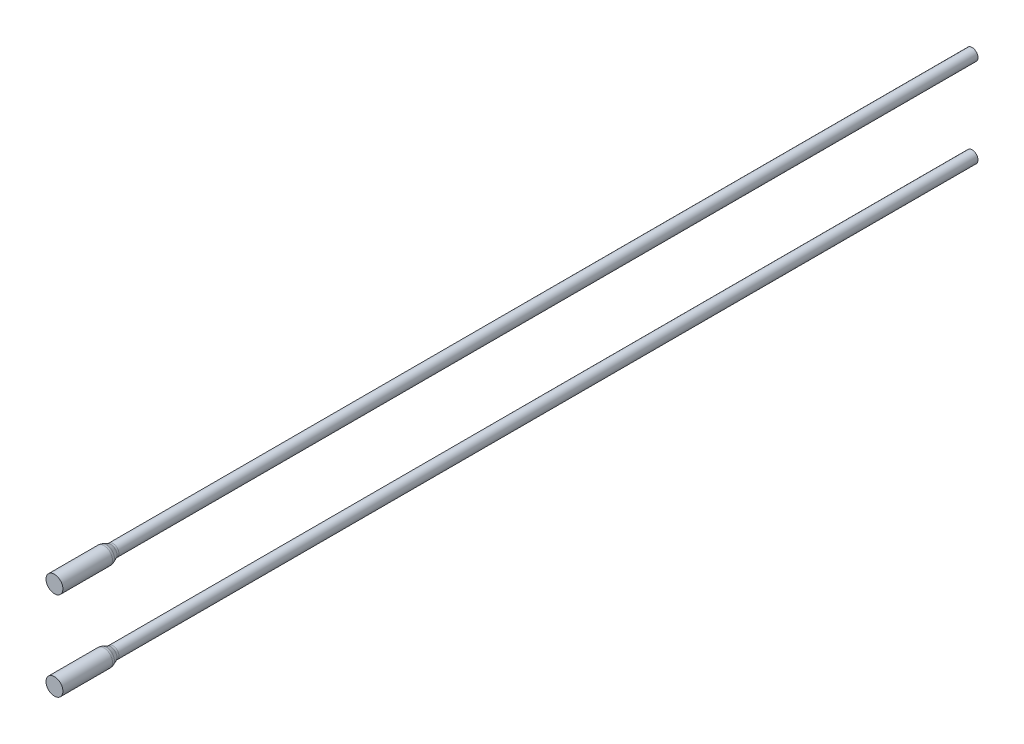
ISO-10303-21;
HEADER;
FILE_DESCRIPTION(('STEP AP214'),'2;1');
FILE_NAME('part.step','',(''),(''),'','','');
FILE_SCHEMA(('AUTOMOTIVE_DESIGN { 1 0 10303 214 1 1 1 1 }'));
ENDSEC;
DATA;
#1=APPLICATION_CONTEXT('core data for automotive mechanical design processes');
#2=APPLICATION_PROTOCOL_DEFINITION('international standard','automotive_design',2000,#1);
#3=PRODUCT_CONTEXT('',#1,'mechanical');
#4=PRODUCT('Part','Part','',(#3));
#5=PRODUCT_RELATED_PRODUCT_CATEGORY('part','',(#4));
#6=PRODUCT_DEFINITION_FORMATION('','',#4);
#7=PRODUCT_DEFINITION_CONTEXT('part definition',#1,'design');
#8=PRODUCT_DEFINITION('design','',#6,#7);
#9=PRODUCT_DEFINITION_SHAPE('','',#8);
#10=(LENGTH_UNIT() NAMED_UNIT(*) SI_UNIT(.MILLI.,.METRE.));
#11=(NAMED_UNIT(*) PLANE_ANGLE_UNIT() SI_UNIT($,.RADIAN.));
#12=(NAMED_UNIT(*) SI_UNIT($,.STERADIAN.) SOLID_ANGLE_UNIT());
#13=UNCERTAINTY_MEASURE_WITH_UNIT(LENGTH_MEASURE(1.E-05),#10,'distance_accuracy_value','');
#14=(GEOMETRIC_REPRESENTATION_CONTEXT(3) GLOBAL_UNCERTAINTY_ASSIGNED_CONTEXT((#13)) GLOBAL_UNIT_ASSIGNED_CONTEXT((#10,
#11,#12)) REPRESENTATION_CONTEXT('',''));
#15=CARTESIAN_POINT('',(0.,0.,0.));
#16=DIRECTION('',(0.,0.,1.));
#17=DIRECTION('',(1.,0.,0.));
#18=AXIS2_PLACEMENT_3D('',#15,#16,#17);
#19=CARTESIAN_POINT('',(0.,1.70000000000003,0.15));
#20=DIRECTION('',(0.,0.,1.));
#21=DIRECTION('',(1.,0.,0.));
#22=AXIS2_PLACEMENT_3D('',#19,#20,#21);
#23=PLANE('',#22);
#24=CARTESIAN_POINT('',(0.,1.70000000000003,0.15));
#25=DIRECTION('',(0.,0.,1.));
#26=DIRECTION('',(1.,0.,0.));
#27=AXIS2_PLACEMENT_3D('',#24,#25,#26);
#28=CIRCLE('',#27,0.325);
#29=CARTESIAN_POINT('',(0.325,1.70000000000003,0.15));
#30=VERTEX_POINT('',#29);
#31=EDGE_CURVE('P0_E18',#30,#30,#28,.F.);
#32=ORIENTED_EDGE('',*,*,#31,.F.);
#33=EDGE_LOOP('',(#32));
#34=FACE_BOUND('',#33,.T.);
#35=ADVANCED_FACE('P0_F15',(#34),#23,.T.);
#36=CARTESIAN_POINT('',(0.,1.70000000000003,-1.8));
#37=DIRECTION('',(0.,0.,1.));
#38=DIRECTION('',(1.,0.,0.));
#39=AXIS2_PLACEMENT_3D('',#36,#37,#38);
#40=CYLINDRICAL_SURFACE('',#39,0.325);
#41=ORIENTED_EDGE('',*,*,#31,.T.);
#42=EDGE_LOOP('',(#41));
#43=FACE_BOUND('',#42,.T.);
#44=CARTESIAN_POINT('',(0.,1.70000000000003,-1.75185439910819));
#45=DIRECTION('',(0.,0.,1.));
#46=DIRECTION('',(1.,0.,0.));
#47=AXIS2_PLACEMENT_3D('',#44,#45,#46);
#48=CIRCLE('',#47,0.325);
#49=CARTESIAN_POINT('',(0.325,1.70000000000003,-1.75185439910819));
#50=VERTEX_POINT('',#49);
#51=EDGE_CURVE('P0_E58',#50,#50,#48,.F.);
#52=ORIENTED_EDGE('',*,*,#51,.F.);
#53=EDGE_LOOP('',(#52));
#54=FACE_BOUND('',#53,.T.);
#55=ADVANCED_FACE('P0_F53',(#43,#54),#40,.T.);
#56=CARTESIAN_POINT('',(0.075,1.70000000000003,-1.75185439910819));
#57=DIRECTION('',(0.,1.,0.));
#58=DIRECTION('',(1.,0.,0.));
#59=AXIS2_PLACEMENT_3D('',#56,#57,#58);
#60=CIRCLE('',#59,0.25);
#61=TRIMMED_CURVE('',#60,(PARAMETER_VALUE(-1.87548898081029)),
(PARAMETER_VALUE(1.87548898081029)),.T.,.PARAMETER.);
#62=CARTESIAN_POINT('',(0.,1.70000000000003,-1.75185439910819));
#63=DIRECTION('',(0.,0.,1.));
#64=AXIS1_PLACEMENT('',#62,#63);
#65=SURFACE_OF_REVOLUTION('',#61,#64);
#66=ORIENTED_EDGE('',*,*,#51,.T.);
#67=EDGE_LOOP('',(#66));
#68=FACE_BOUND('',#67,.T.);
#69=CARTESIAN_POINT('',(0.,1.70000000000003,-1.84470206812648));
#70=DIRECTION('',(0.,0.,1.));
#71=DIRECTION('',(1.,0.,0.));
#72=AXIS2_PLACEMENT_3D('',#69,#70,#71);
#73=CIRCLE('',#72,0.30711917275994);
#74=CARTESIAN_POINT('',(0.30711917275994,1.70000000000003,-1.84470206812648));
#75=VERTEX_POINT('',#74);
#76=EDGE_CURVE('P0_E57',#75,#75,#73,.F.);
#77=ORIENTED_EDGE('',*,*,#76,.F.);
#78=EDGE_LOOP('',(#77));
#79=FACE_BOUND('',#78,.T.);
#80=ADVANCED_FACE('P0_F49',(#68,#79),#65,.F.);
#81=CARTESIAN_POINT('',(0.,1.70000000000003,-1.84470206835385));
#82=DIRECTION('',(0.,0.,1.));
#83=DIRECTION('',(1.,0.,0.));
#84=AXIS2_PLACEMENT_3D('',#81,#82,#83);
#85=CONICAL_SURFACE('',#84,0.307119172674675,0.380506377173391);
#86=ORIENTED_EDGE('',*,*,#76,.T.);
#87=EDGE_LOOP('',(#86));
#88=FACE_BOUND('',#87,.T.);
#89=CARTESIAN_POINT('',(0.,1.70000000000003,-2.00529793180329));
#90=DIRECTION('',(0.,0.,-1.));
#91=DIRECTION('',(-1.,0.,0.));
#92=AXIS2_PLACEMENT_3D('',#89,#90,#91);
#93=CIRCLE('',#92,0.242880827278685);
#94=CARTESIAN_POINT('',(-0.242880827278685,1.70000000000003,-2.00529793180329));
#95=VERTEX_POINT('',#94);
#96=EDGE_CURVE('P0_E30',#95,#95,#93,.F.);
#97=ORIENTED_EDGE('',*,*,#96,.T.);
#98=EDGE_LOOP('',(#97));
#99=FACE_BOUND('',#98,.T.);
#100=ADVANCED_FACE('P0_F45',(#88,#99),#85,.T.);
#101=CARTESIAN_POINT('',(0.,1.70000000000003,-35.05));
#102=DIRECTION('',(0.,0.,-1.));
#103=DIRECTION('',(-1.,0.,0.));
#104=AXIS2_PLACEMENT_3D('',#101,#102,#103);
#105=PLANE('',#104);
#106=CARTESIAN_POINT('',(0.,1.70000000000003,-35.05));
#107=DIRECTION('',(0.,0.,1.));
#108=DIRECTION('',(1.,0.,0.));
#109=AXIS2_PLACEMENT_3D('',#106,#107,#108);
#110=CIRCLE('',#109,0.225);
#111=CARTESIAN_POINT('',(0.225,1.70000000000003,-35.05));
#112=VERTEX_POINT('',#111);
#113=EDGE_CURVE('P0_E23',#112,#112,#110,.T.);
#114=ORIENTED_EDGE('',*,*,#113,.F.);
#115=EDGE_LOOP('',(#114));
#116=FACE_BOUND('',#115,.T.);
#117=ADVANCED_FACE('P0_F41',(#116),#105,.T.);
#118=CARTESIAN_POINT('',(0.,1.70000000000003,-2.09814560089181));
#119=DIRECTION('',(0.,0.,-1.));
#120=DIRECTION('',(-1.,0.,0.));
#121=AXIS2_PLACEMENT_3D('',#118,#119,#120);
#122=TOROIDAL_SURFACE('',#121,0.475,0.25);
#123=CARTESIAN_POINT('',(0.,1.70000000000003,-2.09814560089181));
#124=DIRECTION('',(0.,0.,1.));
#125=DIRECTION('',(1.,0.,0.));
#126=AXIS2_PLACEMENT_3D('',#123,#124,#125);
#127=CIRCLE('',#126,0.225);
#128=CARTESIAN_POINT('',(0.225,1.70000000000003,-2.09814560089181));
#129=VERTEX_POINT('',#128);
#130=EDGE_CURVE('P0_E10',#129,#129,#127,.F.);
#131=ORIENTED_EDGE('',*,*,#130,.F.);
#132=EDGE_LOOP('',(#131));
#133=FACE_BOUND('',#132,.T.);
#134=ORIENTED_EDGE('',*,*,#96,.F.);
#135=EDGE_LOOP('',(#134));
#136=FACE_BOUND('',#135,.T.);
#137=ADVANCED_FACE('P0_F36',(#133,#136),#122,.F.);
#138=CARTESIAN_POINT('',(0.,1.70000000000003,-35.05));
#139=DIRECTION('',(0.,0.,1.));
#140=DIRECTION('',(1.,0.,0.));
#141=AXIS2_PLACEMENT_3D('',#138,#139,#140);
#142=CYLINDRICAL_SURFACE('',#141,0.225);
#143=ORIENTED_EDGE('',*,*,#130,.T.);
#144=EDGE_LOOP('',(#143));
#145=FACE_BOUND('',#144,.T.);
#146=ORIENTED_EDGE('',*,*,#113,.T.);
#147=EDGE_LOOP('',(#146));
#148=FACE_BOUND('',#147,.T.);
#149=ADVANCED_FACE('P0_F40',(#145,#148),#142,.T.);
#150=CLOSED_SHELL('',(#35,#55,#80,#100,#117,#137,#149));
#151=MANIFOLD_SOLID_BREP('P0_B1',#150);
#152=CARTESIAN_POINT('',(0.,-1.70000000000003,0.15));
#153=DIRECTION('',(0.,0.,1.));
#154=DIRECTION('',(1.,0.,0.));
#155=AXIS2_PLACEMENT_3D('',#152,#153,#154);
#156=PLANE('',#155);
#157=CARTESIAN_POINT('',(0.,-1.70000000000003,0.15));
#158=DIRECTION('',(0.,0.,1.));
#159=DIRECTION('',(1.,0.,0.));
#160=AXIS2_PLACEMENT_3D('',#157,#158,#159);
#161=CIRCLE('',#160,0.325);
#162=CARTESIAN_POINT('',(0.325,-1.70000000000003,0.15));
#163=VERTEX_POINT('',#162);
#164=EDGE_CURVE('P1_E18',#163,#163,#161,.F.);
#165=ORIENTED_EDGE('',*,*,#164,.F.);
#166=EDGE_LOOP('',(#165));
#167=FACE_BOUND('',#166,.T.);
#168=ADVANCED_FACE('P1_F15',(#167),#156,.T.);
#169=CARTESIAN_POINT('',(0.,-1.70000000000003,-1.8));
#170=DIRECTION('',(0.,0.,1.));
#171=DIRECTION('',(1.,0.,0.));
#172=AXIS2_PLACEMENT_3D('',#169,#170,#171);
#173=CYLINDRICAL_SURFACE('',#172,0.325);
#174=ORIENTED_EDGE('',*,*,#164,.T.);
#175=EDGE_LOOP('',(#174));
#176=FACE_BOUND('',#175,.T.);
#177=CARTESIAN_POINT('',(0.,-1.70000000000003,-1.75185439910819));
#178=DIRECTION('',(0.,0.,1.));
#179=DIRECTION('',(1.,0.,0.));
#180=AXIS2_PLACEMENT_3D('',#177,#178,#179);
#181=CIRCLE('',#180,0.325);
#182=CARTESIAN_POINT('',(0.325,-1.70000000000003,-1.75185439910819));
#183=VERTEX_POINT('',#182);
#184=EDGE_CURVE('P1_E55',#183,#183,#181,.F.);
#185=ORIENTED_EDGE('',*,*,#184,.F.);
#186=EDGE_LOOP('',(#185));
#187=FACE_BOUND('',#186,.T.);
#188=ADVANCED_FACE('P1_F50',(#176,#187),#173,.T.);
#189=CARTESIAN_POINT('',(0.075,-1.70000000000003,-1.75185439910819));
#190=DIRECTION('',(0.,1.,0.));
#191=DIRECTION('',(1.,0.,0.));
#192=AXIS2_PLACEMENT_3D('',#189,#190,#191);
#193=CIRCLE('',#192,0.25);
#194=TRIMMED_CURVE('',#193,(PARAMETER_VALUE(-1.87548898081029)),
(PARAMETER_VALUE(1.87548898081029)),.T.,.PARAMETER.);
#195=CARTESIAN_POINT('',(0.,-1.70000000000003,-1.75185439910819));
#196=DIRECTION('',(0.,0.,1.));
#197=AXIS1_PLACEMENT('',#195,#196);
#198=SURFACE_OF_REVOLUTION('',#194,#197);
#199=ORIENTED_EDGE('',*,*,#184,.T.);
#200=EDGE_LOOP('',(#199));
#201=FACE_BOUND('',#200,.T.);
#202=CARTESIAN_POINT('',(0.,-1.70000000000003,-1.84470206818332));
#203=DIRECTION('',(0.,0.,1.));
#204=DIRECTION('',(1.,0.,0.));
#205=AXIS2_PLACEMENT_3D('',#202,#203,#204);
#206=CIRCLE('',#205,0.30711917275994);
#207=CARTESIAN_POINT('',(0.30711917275994,-1.70000000000003,-1.84470206818332));
#208=VERTEX_POINT('',#207);
#209=EDGE_CURVE('P1_E54',#208,#208,#206,.F.);
#210=ORIENTED_EDGE('',*,*,#209,.F.);
#211=EDGE_LOOP('',(#210));
#212=FACE_BOUND('',#211,.T.);
#213=ADVANCED_FACE('P1_F46',(#201,#212),#198,.F.);
#214=CARTESIAN_POINT('',(0.,-1.70000000000003,-1.84470206818332));
#215=DIRECTION('',(0.,0.,1.));
#216=DIRECTION('',(1.,0.,0.));
#217=AXIS2_PLACEMENT_3D('',#214,#215,#216);
#218=CONICAL_SURFACE('',#217,0.30711917275994,0.380506377264931);
#219=ORIENTED_EDGE('',*,*,#209,.T.);
#220=EDGE_LOOP('',(#219));
#221=FACE_BOUND('',#220,.T.);
#222=CARTESIAN_POINT('',(0.,-1.70000000000003,-2.00529793180329));
#223=DIRECTION('',(0.,0.,-1.));
#224=DIRECTION('',(-1.,0.,0.));
#225=AXIS2_PLACEMENT_3D('',#222,#223,#224);
#226=CIRCLE('',#225,0.242880827278685);
#227=CARTESIAN_POINT('',(-0.242880827278685,-1.70000000000003,-2.00529793180329));
#228=VERTEX_POINT('',#227);
#229=EDGE_CURVE('P1_E27',#228,#228,#226,.F.);
#230=ORIENTED_EDGE('',*,*,#229,.T.);
#231=EDGE_LOOP('',(#230));
#232=FACE_BOUND('',#231,.T.);
#233=ADVANCED_FACE('P1_F42',(#221,#232),#218,.T.);
#234=CARTESIAN_POINT('',(0.,-1.70000000000003,-35.05));
#235=DIRECTION('',(0.,0.,-1.));
#236=DIRECTION('',(-1.,0.,0.));
#237=AXIS2_PLACEMENT_3D('',#234,#235,#236);
#238=PLANE('',#237);
#239=CARTESIAN_POINT('',(0.,-1.70000000000003,-35.05));
#240=DIRECTION('',(0.,0.,1.));
#241=DIRECTION('',(1.,0.,0.));
#242=AXIS2_PLACEMENT_3D('',#239,#240,#241);
#243=CIRCLE('',#242,0.225);
#244=CARTESIAN_POINT('',(0.225,-1.70000000000003,-35.05));
#245=VERTEX_POINT('',#244);
#246=EDGE_CURVE('P1_E22',#245,#245,#243,.T.);
#247=ORIENTED_EDGE('',*,*,#246,.F.);
#248=EDGE_LOOP('',(#247));
#249=FACE_BOUND('',#248,.T.);
#250=ADVANCED_FACE('P1_F38',(#249),#238,.T.);
#251=CARTESIAN_POINT('',(0.,-1.70000000000003,-2.09814560089181));
#252=DIRECTION('',(0.,0.,-1.));
#253=DIRECTION('',(-1.,0.,0.));
#254=AXIS2_PLACEMENT_3D('',#251,#252,#253);
#255=TOROIDAL_SURFACE('',#254,0.475,0.25);
#256=CARTESIAN_POINT('',(0.,-1.70000000000003,-2.09814560089181));
#257=DIRECTION('',(0.,0.,1.));
#258=DIRECTION('',(1.,0.,0.));
#259=AXIS2_PLACEMENT_3D('',#256,#257,#258);
#260=CIRCLE('',#259,0.225);
#261=CARTESIAN_POINT('',(0.225,-1.70000000000003,-2.09814560089181));
#262=VERTEX_POINT('',#261);
#263=EDGE_CURVE('P1_E10',#262,#262,#260,.F.);
#264=ORIENTED_EDGE('',*,*,#263,.F.);
#265=EDGE_LOOP('',(#264));
#266=FACE_BOUND('',#265,.T.);
#267=ORIENTED_EDGE('',*,*,#229,.F.);
#268=EDGE_LOOP('',(#267));
#269=FACE_BOUND('',#268,.T.);
#270=ADVANCED_FACE('P1_F33',(#266,#269),#255,.F.);
#271=CARTESIAN_POINT('',(0.,-1.70000000000003,-35.05));
#272=DIRECTION('',(0.,0.,1.));
#273=DIRECTION('',(1.,0.,0.));
#274=AXIS2_PLACEMENT_3D('',#271,#272,#273);
#275=CYLINDRICAL_SURFACE('',#274,0.225);
#276=ORIENTED_EDGE('',*,*,#263,.T.);
#277=EDGE_LOOP('',(#276));
#278=FACE_BOUND('',#277,.T.);
#279=ORIENTED_EDGE('',*,*,#246,.T.);
#280=EDGE_LOOP('',(#279));
#281=FACE_BOUND('',#280,.T.);
#282=ADVANCED_FACE('P1_F37',(#278,#281),#275,.T.);
#283=CLOSED_SHELL('',(#168,#188,#213,#233,#250,#270,#282));
#284=MANIFOLD_SOLID_BREP('P1_B1',#283);
#285=ADVANCED_BREP_SHAPE_REPRESENTATION('',(#18,#151,#284),#14);
#286=SHAPE_DEFINITION_REPRESENTATION(#9,#285);
ENDSEC;
END-ISO-10303-21;
